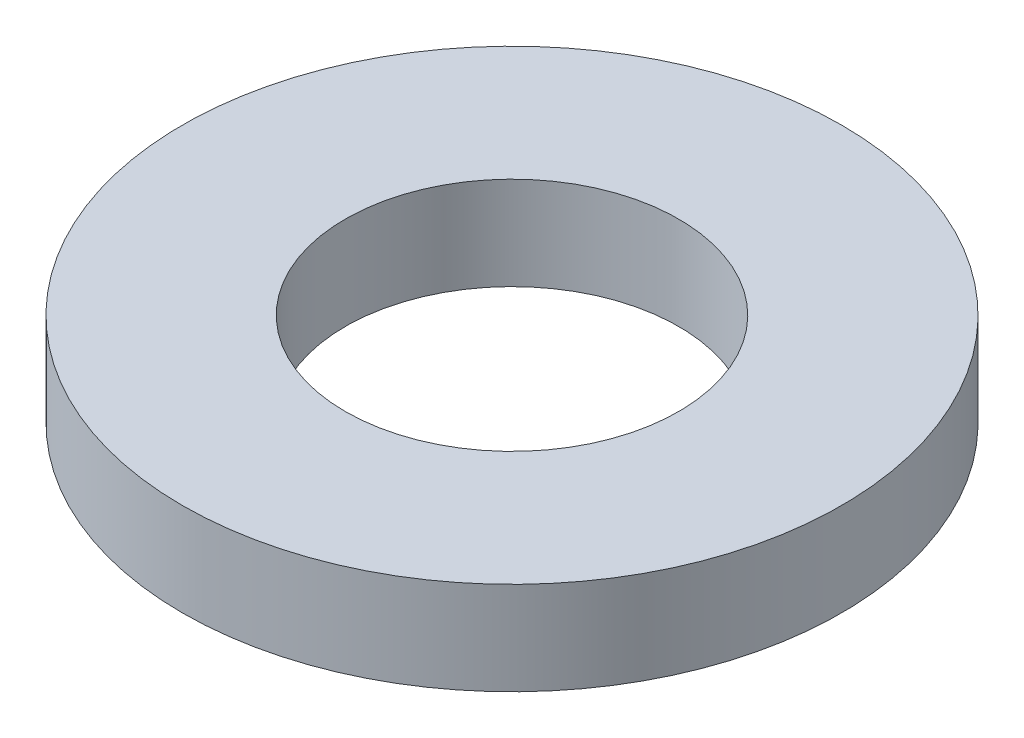
ISO-10303-21;
HEADER;
FILE_DESCRIPTION(('STEP AP214'),'2;1');
FILE_NAME('part.step','',(''),(''),'','','');
FILE_SCHEMA(('AUTOMOTIVE_DESIGN { 1 0 10303 214 1 1 1 1 }'));
ENDSEC;
DATA;
#1=APPLICATION_CONTEXT('core data for automotive mechanical design processes');
#2=APPLICATION_PROTOCOL_DEFINITION('international standard','automotive_design',2000,#1);
#3=PRODUCT_CONTEXT('',#1,'mechanical');
#4=PRODUCT('Part','Part','',(#3));
#5=PRODUCT_RELATED_PRODUCT_CATEGORY('part','',(#4));
#6=PRODUCT_DEFINITION_FORMATION('','',#4);
#7=PRODUCT_DEFINITION_CONTEXT('part definition',#1,'design');
#8=PRODUCT_DEFINITION('design','',#6,#7);
#9=PRODUCT_DEFINITION_SHAPE('','',#8);
#10=(LENGTH_UNIT() NAMED_UNIT(*) SI_UNIT(.MILLI.,.METRE.));
#11=(NAMED_UNIT(*) PLANE_ANGLE_UNIT() SI_UNIT($,.RADIAN.));
#12=(NAMED_UNIT(*) SI_UNIT($,.STERADIAN.) SOLID_ANGLE_UNIT());
#13=UNCERTAINTY_MEASURE_WITH_UNIT(LENGTH_MEASURE(1.E-05),#10,'distance_accuracy_value','');
#14=(GEOMETRIC_REPRESENTATION_CONTEXT(3) GLOBAL_UNCERTAINTY_ASSIGNED_CONTEXT((#13)) GLOBAL_UNIT_ASSIGNED_CONTEXT((#10,
#11,#12)) REPRESENTATION_CONTEXT('',''));
#15=CARTESIAN_POINT('',(0.,0.,0.));
#16=DIRECTION('',(0.,0.,1.));
#17=DIRECTION('',(1.,0.,0.));
#18=AXIS2_PLACEMENT_3D('',#15,#16,#17);
#19=CARTESIAN_POINT('',(0.,1.2,0.));
#20=DIRECTION('',(0.,1.,0.));
#21=DIRECTION('',(0.,0.,1.));
#22=AXIS2_PLACEMENT_3D('',#19,#20,#21);
#23=PLANE('',#22);
#24=CARTESIAN_POINT('',(0.,1.2,0.));
#25=DIRECTION('',(0.,1.,0.));
#26=DIRECTION('',(0.,0.,1.));
#27=AXIS2_PLACEMENT_3D('',#24,#25,#26);
#28=CIRCLE('',#27,4.25);
#29=CARTESIAN_POINT('',(0.,1.2,4.25));
#30=VERTEX_POINT('',#29);
#31=EDGE_CURVE('E10',#30,#30,#28,.T.);
#32=ORIENTED_EDGE('',*,*,#31,.T.);
#33=EDGE_LOOP('',(#32));
#34=FACE_BOUND('',#33,.T.);
#35=CARTESIAN_POINT('',(0.,1.2,0.));
#36=DIRECTION('',(0.,1.,0.));
#37=DIRECTION('',(0.,0.,1.));
#38=AXIS2_PLACEMENT_3D('',#35,#36,#37);
#39=CIRCLE('',#38,2.15);
#40=CARTESIAN_POINT('',(0.,1.2,2.15));
#41=VERTEX_POINT('',#40);
#42=EDGE_CURVE('E44',#41,#41,#39,.T.);
#43=ORIENTED_EDGE('',*,*,#42,.F.);
#44=EDGE_LOOP('',(#43));
#45=FACE_BOUND('',#44,.T.);
#46=ADVANCED_FACE('F33',(#34,#45),#23,.T.);
#47=CARTESIAN_POINT('',(0.,0.,0.));
#48=DIRECTION('',(0.,1.,0.));
#49=DIRECTION('',(0.,0.,1.));
#50=AXIS2_PLACEMENT_3D('',#47,#48,#49);
#51=PLANE('',#50);
#52=CARTESIAN_POINT('',(0.,0.,0.));
#53=DIRECTION('',(0.,1.,0.));
#54=DIRECTION('',(0.,0.,1.));
#55=AXIS2_PLACEMENT_3D('',#52,#53,#54);
#56=CIRCLE('',#55,4.25);
#57=CARTESIAN_POINT('',(0.,0.,4.25));
#58=VERTEX_POINT('',#57);
#59=EDGE_CURVE('E37',#58,#58,#56,.T.);
#60=ORIENTED_EDGE('',*,*,#59,.F.);
#61=EDGE_LOOP('',(#60));
#62=FACE_BOUND('',#61,.T.);
#63=CARTESIAN_POINT('',(0.,0.,0.));
#64=DIRECTION('',(0.,1.,0.));
#65=DIRECTION('',(0.,0.,1.));
#66=AXIS2_PLACEMENT_3D('',#63,#64,#65);
#67=CIRCLE('',#66,2.15);
#68=CARTESIAN_POINT('',(0.,0.,2.15));
#69=VERTEX_POINT('',#68);
#70=EDGE_CURVE('E46',#69,#69,#67,.T.);
#71=ORIENTED_EDGE('',*,*,#70,.T.);
#72=EDGE_LOOP('',(#71));
#73=FACE_BOUND('',#72,.T.);
#74=ADVANCED_FACE('F56',(#62,#73),#51,.F.);
#75=CARTESIAN_POINT('',(0.,1.2,0.));
#76=DIRECTION('',(0.,-1.,0.));
#77=DIRECTION('',(0.,0.,-1.));
#78=AXIS2_PLACEMENT_3D('',#75,#76,#77);
#79=CYLINDRICAL_SURFACE('',#78,4.25);
#80=ORIENTED_EDGE('',*,*,#31,.F.);
#81=EDGE_LOOP('',(#80));
#82=FACE_BOUND('',#81,.T.);
#83=ORIENTED_EDGE('',*,*,#59,.T.);
#84=EDGE_LOOP('',(#83));
#85=FACE_BOUND('',#84,.T.);
#86=ADVANCED_FACE('F35',(#82,#85),#79,.T.);
#87=CARTESIAN_POINT('',(0.,1.2,0.));
#88=DIRECTION('',(0.,-1.,0.));
#89=DIRECTION('',(0.,0.,-1.));
#90=AXIS2_PLACEMENT_3D('',#87,#88,#89);
#91=CYLINDRICAL_SURFACE('',#90,2.15);
#92=ORIENTED_EDGE('',*,*,#42,.T.);
#93=EDGE_LOOP('',(#92));
#94=FACE_BOUND('',#93,.T.);
#95=ORIENTED_EDGE('',*,*,#70,.F.);
#96=EDGE_LOOP('',(#95));
#97=FACE_BOUND('',#96,.T.);
#98=ADVANCED_FACE('F52',(#94,#97),#91,.F.);
#99=CLOSED_SHELL('',(#46,#74,#86,#98));
#100=MANIFOLD_SOLID_BREP('B2',#99);
#101=ADVANCED_BREP_SHAPE_REPRESENTATION('',(#18,#100),#14);
#102=SHAPE_DEFINITION_REPRESENTATION(#9,#101);
ENDSEC;
END-ISO-10303-21;
